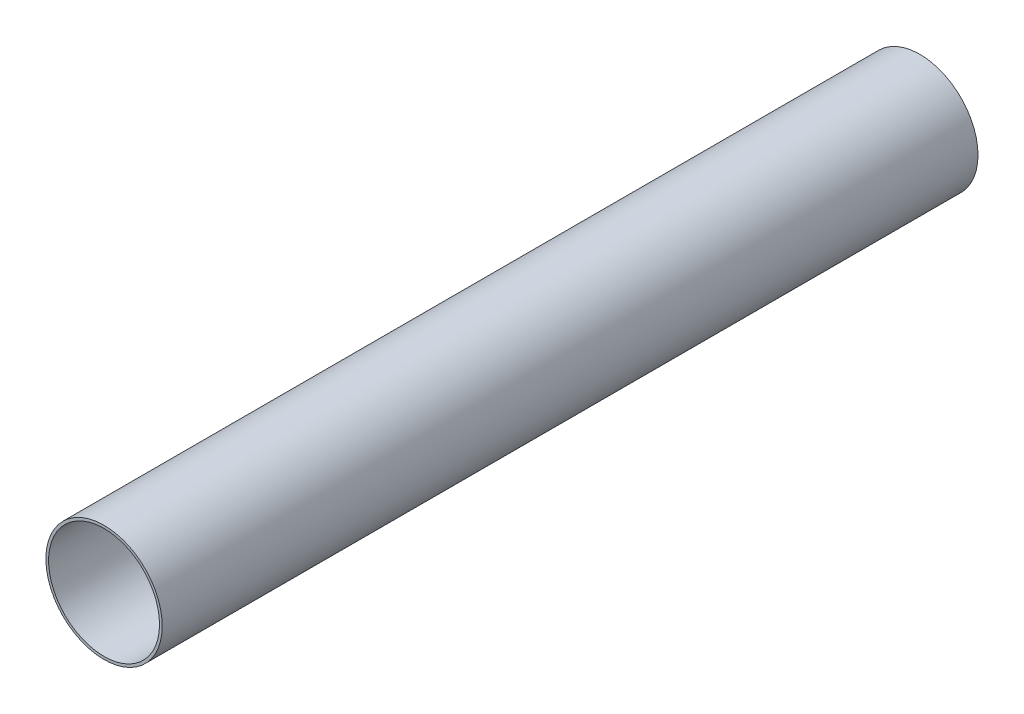
ISO-10303-21;
HEADER;
FILE_DESCRIPTION(('STEP AP214'),'2;1');
FILE_NAME('part.step','',(''),(''),'','','');
FILE_SCHEMA(('AUTOMOTIVE_DESIGN { 1 0 10303 214 1 1 1 1 }'));
ENDSEC;
DATA;
#1=APPLICATION_CONTEXT('core data for automotive mechanical design processes');
#2=APPLICATION_PROTOCOL_DEFINITION('international standard','automotive_design',2000,#1);
#3=PRODUCT_CONTEXT('',#1,'mechanical');
#4=PRODUCT('Part','Part','',(#3));
#5=PRODUCT_RELATED_PRODUCT_CATEGORY('part','',(#4));
#6=PRODUCT_DEFINITION_FORMATION('','',#4);
#7=PRODUCT_DEFINITION_CONTEXT('part definition',#1,'design');
#8=PRODUCT_DEFINITION('design','',#6,#7);
#9=PRODUCT_DEFINITION_SHAPE('','',#8);
#10=(LENGTH_UNIT() NAMED_UNIT(*) SI_UNIT(.MILLI.,.METRE.));
#11=(NAMED_UNIT(*) PLANE_ANGLE_UNIT() SI_UNIT($,.RADIAN.));
#12=(NAMED_UNIT(*) SI_UNIT($,.STERADIAN.) SOLID_ANGLE_UNIT());
#13=UNCERTAINTY_MEASURE_WITH_UNIT(LENGTH_MEASURE(1.E-05),#10,'distance_accuracy_value','');
#14=(GEOMETRIC_REPRESENTATION_CONTEXT(3) GLOBAL_UNCERTAINTY_ASSIGNED_CONTEXT((#13)) GLOBAL_UNIT_ASSIGNED_CONTEXT((#10,
#11,#12)) REPRESENTATION_CONTEXT('',''));
#15=CARTESIAN_POINT('',(0.,0.,0.));
#16=DIRECTION('',(0.,0.,1.));
#17=DIRECTION('',(1.,0.,0.));
#18=AXIS2_PLACEMENT_3D('',#15,#16,#17);
#19=CARTESIAN_POINT('',(0.,0.,-362.));
#20=DIRECTION('',(0.,0.,1.));
#21=DIRECTION('',(1.,0.,0.));
#22=AXIS2_PLACEMENT_3D('',#19,#20,#21);
#23=CYLINDRICAL_SURFACE('',#22,51.6125);
#24=CARTESIAN_POINT('',(0.,0.,-362.));
#25=DIRECTION('',(0.,0.,1.));
#26=DIRECTION('',(1.,0.,0.));
#27=AXIS2_PLACEMENT_3D('',#24,#25,#26);
#28=CIRCLE('',#27,51.6125);
#29=CARTESIAN_POINT('',(51.6125,0.,-362.));
#30=VERTEX_POINT('',#29);
#31=EDGE_CURVE('E10',#30,#30,#28,.T.);
#32=ORIENTED_EDGE('',*,*,#31,.T.);
#33=EDGE_LOOP('',(#32));
#34=FACE_BOUND('',#33,.T.);
#35=CARTESIAN_POINT('',(0.,0.,362.));
#36=DIRECTION('',(0.,0.,1.));
#37=DIRECTION('',(1.,0.,0.));
#38=AXIS2_PLACEMENT_3D('',#35,#36,#37);
#39=CIRCLE('',#38,51.6125);
#40=CARTESIAN_POINT('',(51.6125,0.,362.));
#41=VERTEX_POINT('',#40);
#42=EDGE_CURVE('E42',#41,#41,#39,.T.);
#43=ORIENTED_EDGE('',*,*,#42,.F.);
#44=EDGE_LOOP('',(#43));
#45=FACE_BOUND('',#44,.T.);
#46=ADVANCED_FACE('F32',(#34,#45),#23,.T.);
#47=CARTESIAN_POINT('',(0.,0.,-362.));
#48=DIRECTION('',(0.,0.,1.));
#49=DIRECTION('',(1.,0.,0.));
#50=AXIS2_PLACEMENT_3D('',#47,#48,#49);
#51=PLANE('',#50);
#52=CARTESIAN_POINT('',(0.,0.,-362.));
#53=DIRECTION('',(0.,0.,1.));
#54=DIRECTION('',(1.,0.,0.));
#55=AXIS2_PLACEMENT_3D('',#52,#53,#54);
#56=CIRCLE('',#55,49.2125);
#57=CARTESIAN_POINT('',(49.2125,0.,-362.));
#58=VERTEX_POINT('',#57);
#59=EDGE_CURVE('E38',#58,#58,#56,.T.);
#60=ORIENTED_EDGE('',*,*,#59,.T.);
#61=EDGE_LOOP('',(#60));
#62=FACE_BOUND('',#61,.T.);
#63=ORIENTED_EDGE('',*,*,#31,.F.);
#64=EDGE_LOOP('',(#63));
#65=FACE_BOUND('',#64,.T.);
#66=ADVANCED_FACE('F61',(#62,#65),#51,.F.);
#67=CARTESIAN_POINT('',(0.,0.,-362.));
#68=DIRECTION('',(0.,0.,1.));
#69=DIRECTION('',(1.,0.,0.));
#70=AXIS2_PLACEMENT_3D('',#67,#68,#69);
#71=CYLINDRICAL_SURFACE('',#70,49.2125);
#72=ORIENTED_EDGE('',*,*,#59,.F.);
#73=EDGE_LOOP('',(#72));
#74=FACE_BOUND('',#73,.T.);
#75=CARTESIAN_POINT('',(0.,0.,362.));
#76=DIRECTION('',(0.,0.,1.));
#77=DIRECTION('',(1.,0.,0.));
#78=AXIS2_PLACEMENT_3D('',#75,#76,#77);
#79=CIRCLE('',#78,49.2125);
#80=CARTESIAN_POINT('',(49.2125,0.,362.));
#81=VERTEX_POINT('',#80);
#82=EDGE_CURVE('E46',#81,#81,#79,.T.);
#83=ORIENTED_EDGE('',*,*,#82,.T.);
#84=EDGE_LOOP('',(#83));
#85=FACE_BOUND('',#84,.T.);
#86=ADVANCED_FACE('F52',(#74,#85),#71,.F.);
#87=CARTESIAN_POINT('',(0.,0.,362.));
#88=DIRECTION('',(0.,0.,1.));
#89=DIRECTION('',(1.,0.,0.));
#90=AXIS2_PLACEMENT_3D('',#87,#88,#89);
#91=PLANE('',#90);
#92=ORIENTED_EDGE('',*,*,#42,.T.);
#93=EDGE_LOOP('',(#92));
#94=FACE_BOUND('',#93,.T.);
#95=ORIENTED_EDGE('',*,*,#82,.F.);
#96=EDGE_LOOP('',(#95));
#97=FACE_BOUND('',#96,.T.);
#98=ADVANCED_FACE('F54',(#94,#97),#91,.T.);
#99=CLOSED_SHELL('',(#46,#66,#86,#98));
#100=MANIFOLD_SOLID_BREP('B2',#99);
#101=ADVANCED_BREP_SHAPE_REPRESENTATION('',(#18,#100),#14);
#102=SHAPE_DEFINITION_REPRESENTATION(#9,#101);
ENDSEC;
END-ISO-10303-21;
